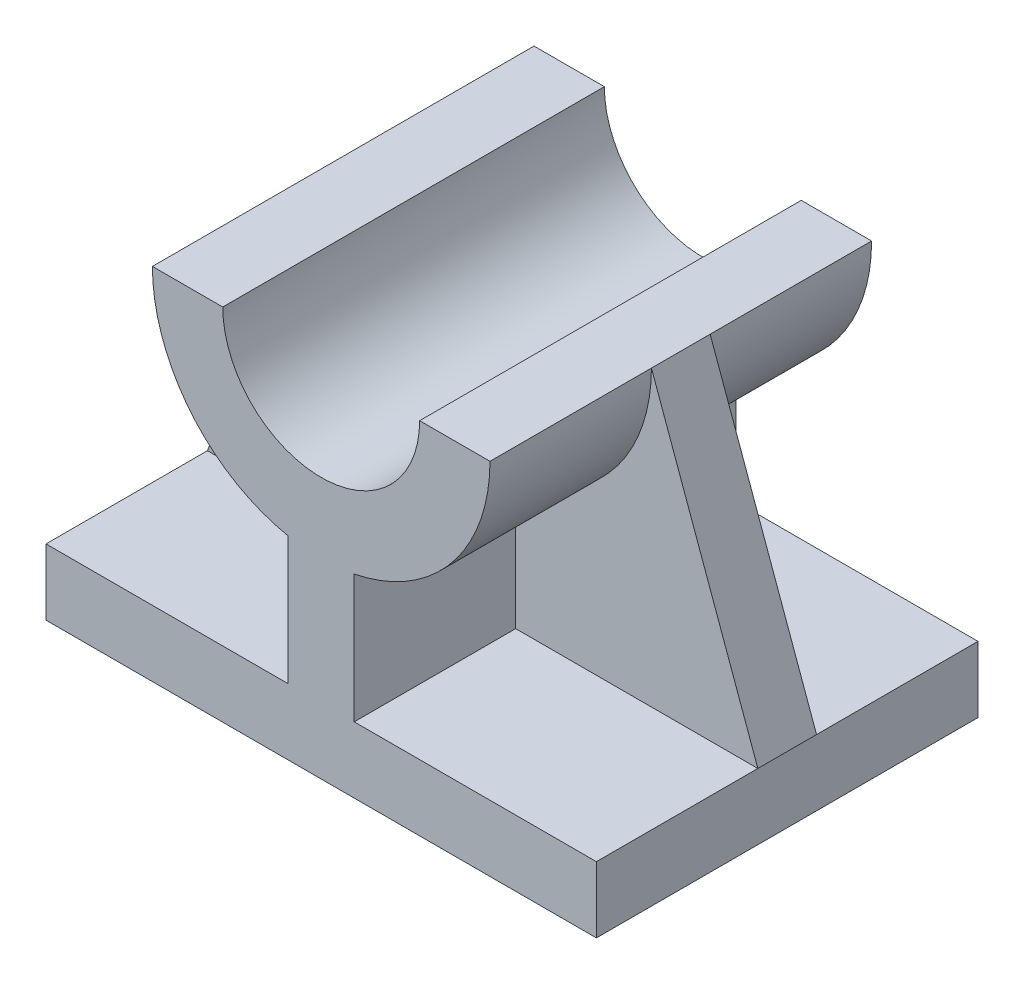
ISO-10303-21;
HEADER;
FILE_DESCRIPTION(('STEP AP214'),'2;1');
FILE_NAME('part.step','',(''),(''),'','','');
FILE_SCHEMA(('AUTOMOTIVE_DESIGN { 1 0 10303 214 1 1 1 1 }'));
ENDSEC;
DATA;
#1=APPLICATION_CONTEXT('core data for automotive mechanical design processes');
#2=APPLICATION_PROTOCOL_DEFINITION('international standard','automotive_design',2000,#1);
#3=PRODUCT_CONTEXT('',#1,'mechanical');
#4=PRODUCT('Part','Part','',(#3));
#5=PRODUCT_RELATED_PRODUCT_CATEGORY('part','',(#4));
#6=PRODUCT_DEFINITION_FORMATION('','',#4);
#7=PRODUCT_DEFINITION_CONTEXT('part definition',#1,'design');
#8=PRODUCT_DEFINITION('design','',#6,#7);
#9=PRODUCT_DEFINITION_SHAPE('','',#8);
#10=(LENGTH_UNIT() NAMED_UNIT(*) SI_UNIT(.MILLI.,.METRE.));
#11=(NAMED_UNIT(*) PLANE_ANGLE_UNIT() SI_UNIT($,.RADIAN.));
#12=(NAMED_UNIT(*) SI_UNIT($,.STERADIAN.) SOLID_ANGLE_UNIT());
#13=UNCERTAINTY_MEASURE_WITH_UNIT(LENGTH_MEASURE(1.E-05),#10,'distance_accuracy_value','');
#14=(GEOMETRIC_REPRESENTATION_CONTEXT(3) GLOBAL_UNCERTAINTY_ASSIGNED_CONTEXT((#13)) GLOBAL_UNIT_ASSIGNED_CONTEXT((#10,
#11,#12)) REPRESENTATION_CONTEXT('',''));
#15=CARTESIAN_POINT('',(0.,0.,0.));
#16=DIRECTION('',(0.,0.,1.));
#17=DIRECTION('',(1.,0.,0.));
#18=AXIS2_PLACEMENT_3D('',#15,#16,#17);
#19=CARTESIAN_POINT('',(0.,49.,26.));
#20=DIRECTION('',(0.,0.,-1.));
#21=DIRECTION('',(-1.,0.,0.));
#22=AXIS2_PLACEMENT_3D('',#19,#20,#21);
#23=CYLINDRICAL_SURFACE('',#22,23.);
#24=DIRECTION('',(0.,0.,-1.));
#25=VECTOR('',#24,1.);
#26=CARTESIAN_POINT('',(-4.5,26.4445128627201,26.));
#27=LINE('',#26,#25);
#28=CARTESIAN_POINT('',(-4.5,26.4445128627201,-4.));
#29=VERTEX_POINT('',#28);
#30=CARTESIAN_POINT('',(-4.5,26.4445128627201,-26.));
#31=VERTEX_POINT('',#30);
#32=EDGE_CURVE('E207',#29,#31,#27,.T.);
#33=ORIENTED_EDGE('',*,*,#32,.F.);
#34=CARTESIAN_POINT('',(0.,49.,-4.));
#35=DIRECTION('',(0.,0.,1.));
#36=DIRECTION('',(1.,0.,0.));
#37=AXIS2_PLACEMENT_3D('',#34,#35,#36);
#38=CIRCLE('',#37,23.);
#39=CARTESIAN_POINT('',(-23.,49.,-4.));
#40=VERTEX_POINT('',#39);
#41=EDGE_CURVE('E382',#29,#40,#38,.F.);
#42=ORIENTED_EDGE('',*,*,#41,.T.);
#43=DIRECTION('',(0.,0.,-1.));
#44=VECTOR('',#43,1.);
#45=CARTESIAN_POINT('',(-23.,49.,26.));
#46=LINE('',#45,#44);
#47=CARTESIAN_POINT('',(-23.,49.,-26.));
#48=VERTEX_POINT('',#47);
#49=EDGE_CURVE('E206',#40,#48,#46,.T.);
#50=ORIENTED_EDGE('',*,*,#49,.T.);
#51=CARTESIAN_POINT('',(0.,49.,-26.));
#52=DIRECTION('',(0.,0.,1.));
#53=DIRECTION('',(1.,0.,0.));
#54=AXIS2_PLACEMENT_3D('',#51,#52,#53);
#55=CIRCLE('',#54,23.);
#56=EDGE_CURVE('E289',#31,#48,#55,.F.);
#57=ORIENTED_EDGE('',*,*,#56,.F.);
#58=EDGE_LOOP('',(#33,#42,#50,#57));
#59=FACE_BOUND('',#58,.T.);
#60=ADVANCED_FACE('F43',(#59),#23,.T.);
#61=CARTESIAN_POINT('',(-4.5,0.,26.));
#62=DIRECTION('',(-1.,0.,0.));
#63=DIRECTION('',(0.,0.,1.));
#64=AXIS2_PLACEMENT_3D('',#61,#62,#63);
#65=PLANE('',#64);
#66=DIRECTION('',(0.,0.,-1.));
#67=VECTOR('',#66,1.);
#68=CARTESIAN_POINT('',(-4.5,9.00000000000001,26.));
#69=LINE('',#68,#67);
#70=CARTESIAN_POINT('',(-4.5,9.00000000000001,-4.));
#71=VERTEX_POINT('',#70);
#72=CARTESIAN_POINT('',(-4.5,9.00000000000001,-26.));
#73=VERTEX_POINT('',#72);
#74=EDGE_CURVE('E216',#71,#73,#69,.T.);
#75=ORIENTED_EDGE('',*,*,#74,.F.);
#76=DIRECTION('',(0.,1.,0.));
#77=VECTOR('',#76,1.);
#78=CARTESIAN_POINT('',(-4.5,0.,-4.));
#79=LINE('',#78,#77);
#80=EDGE_CURVE('E386',#71,#29,#79,.T.);
#81=ORIENTED_EDGE('',*,*,#80,.T.);
#82=ORIENTED_EDGE('',*,*,#32,.T.);
#83=DIRECTION('',(0.,1.,0.));
#84=VECTOR('',#83,1.);
#85=CARTESIAN_POINT('',(-4.5,0.,-26.));
#86=LINE('',#85,#84);
#87=EDGE_CURVE('E285',#73,#31,#86,.T.);
#88=ORIENTED_EDGE('',*,*,#87,.F.);
#89=EDGE_LOOP('',(#75,#81,#82,#88));
#90=FACE_BOUND('',#89,.T.);
#91=ADVANCED_FACE('F425',(#90),#65,.T.);
#92=CARTESIAN_POINT('',(0.,9.00000000000001,26.));
#93=DIRECTION('',(0.,-1.,0.));
#94=DIRECTION('',(1.,0.,0.));
#95=AXIS2_PLACEMENT_3D('',#92,#93,#94);
#96=PLANE('',#95);
#97=DIRECTION('',(-1.,0.,0.));
#98=VECTOR('',#97,1.);
#99=CARTESIAN_POINT('',(0.,9.00000000000001,-4.));
#100=LINE('',#99,#98);
#101=CARTESIAN_POINT('',(-37.5,9.,-3.99999999999999));
#102=VERTEX_POINT('',#101);
#103=EDGE_CURVE('E59',#71,#102,#100,.T.);
#104=ORIENTED_EDGE('',*,*,#103,.F.);
#105=ORIENTED_EDGE('',*,*,#74,.T.);
#106=DIRECTION('',(-1.,0.,0.));
#107=VECTOR('',#106,1.);
#108=CARTESIAN_POINT('',(0.,9.00000000000001,-26.));
#109=LINE('',#108,#107);
#110=CARTESIAN_POINT('',(-37.5,9.,-26.));
#111=VERTEX_POINT('',#110);
#112=EDGE_CURVE('E281',#73,#111,#109,.T.);
#113=ORIENTED_EDGE('',*,*,#112,.T.);
#114=DIRECTION('',(0.,0.,-1.));
#115=VECTOR('',#114,1.);
#116=CARTESIAN_POINT('',(-37.5,9.,26.));
#117=LINE('',#116,#115);
#118=EDGE_CURVE('E221',#102,#111,#117,.T.);
#119=ORIENTED_EDGE('',*,*,#118,.F.);
#120=EDGE_LOOP('',(#104,#105,#113,#119));
#121=FACE_BOUND('',#120,.T.);
#122=ADVANCED_FACE('F427',(#121),#96,.F.);
#123=CARTESIAN_POINT('',(0.,9.00000000000001,26.));
#124=DIRECTION('',(0.,-1.,0.));
#125=DIRECTION('',(0.,0.,-1.));
#126=AXIS2_PLACEMENT_3D('',#123,#124,#125);
#127=PLANE('',#126);
#128=DIRECTION('',(-1.,0.,0.));
#129=VECTOR('',#128,1.);
#130=CARTESIAN_POINT('',(0.,9.00000000000001,-4.));
#131=LINE('',#130,#129);
#132=CARTESIAN_POINT('',(37.5,9.00000000000001,-4.));
#133=VERTEX_POINT('',#132);
#134=CARTESIAN_POINT('',(4.5,9.00000000000001,-4.));
#135=VERTEX_POINT('',#134);
#136=EDGE_CURVE('E347',#133,#135,#131,.T.);
#137=ORIENTED_EDGE('',*,*,#136,.F.);
#138=DIRECTION('',(0.,0.,-1.));
#139=VECTOR('',#138,1.);
#140=CARTESIAN_POINT('',(37.5,9.00000000000001,26.));
#141=LINE('',#140,#139);
#142=CARTESIAN_POINT('',(37.5,9.00000000000001,-26.));
#143=VERTEX_POINT('',#142);
#144=EDGE_CURVE('E234',#133,#143,#141,.T.);
#145=ORIENTED_EDGE('',*,*,#144,.T.);
#146=DIRECTION('',(-1.,0.,0.));
#147=VECTOR('',#146,1.);
#148=CARTESIAN_POINT('',(0.,9.00000000000001,-26.));
#149=LINE('',#148,#147);
#150=CARTESIAN_POINT('',(4.5,9.00000000000001,-26.));
#151=VERTEX_POINT('',#150);
#152=EDGE_CURVE('E267',#143,#151,#149,.T.);
#153=ORIENTED_EDGE('',*,*,#152,.T.);
#154=DIRECTION('',(0.,0.,-1.));
#155=VECTOR('',#154,1.);
#156=CARTESIAN_POINT('',(4.5,9.00000000000001,26.));
#157=LINE('',#156,#155);
#158=EDGE_CURVE('E239',#135,#151,#157,.T.);
#159=ORIENTED_EDGE('',*,*,#158,.F.);
#160=EDGE_LOOP('',(#137,#145,#153,#159));
#161=FACE_BOUND('',#160,.T.);
#162=ADVANCED_FACE('F476',(#161),#127,.F.);
#163=CARTESIAN_POINT('',(4.5,0.,26.));
#164=DIRECTION('',(-1.,0.,0.));
#165=DIRECTION('',(0.,0.,1.));
#166=AXIS2_PLACEMENT_3D('',#163,#164,#165);
#167=PLANE('',#166);
#168=DIRECTION('',(0.,1.,0.));
#169=VECTOR('',#168,1.);
#170=CARTESIAN_POINT('',(4.5,0.,-4.));
#171=LINE('',#170,#169);
#172=CARTESIAN_POINT('',(4.5,26.4445128627201,-4.));
#173=VERTEX_POINT('',#172);
#174=EDGE_CURVE('E350',#135,#173,#171,.T.);
#175=ORIENTED_EDGE('',*,*,#174,.F.);
#176=ORIENTED_EDGE('',*,*,#158,.T.);
#177=DIRECTION('',(0.,1.,0.));
#178=VECTOR('',#177,1.);
#179=CARTESIAN_POINT('',(4.5,0.,-26.));
#180=LINE('',#179,#178);
#181=CARTESIAN_POINT('',(4.5,26.4445128627201,-26.));
#182=VERTEX_POINT('',#181);
#183=EDGE_CURVE('E263',#151,#182,#180,.T.);
#184=ORIENTED_EDGE('',*,*,#183,.T.);
#185=DIRECTION('',(0.,0.,-1.));
#186=VECTOR('',#185,1.);
#187=CARTESIAN_POINT('',(4.5,26.4445128627201,26.));
#188=LINE('',#187,#186);
#189=EDGE_CURVE('E244',#173,#182,#188,.T.);
#190=ORIENTED_EDGE('',*,*,#189,.F.);
#191=EDGE_LOOP('',(#175,#176,#184,#190));
#192=FACE_BOUND('',#191,.T.);
#193=ADVANCED_FACE('F482',(#192),#167,.F.);
#194=CARTESIAN_POINT('',(0.,49.,26.));
#195=DIRECTION('',(0.,0.,-1.));
#196=DIRECTION('',(-1.,0.,0.));
#197=AXIS2_PLACEMENT_3D('',#194,#195,#196);
#198=CYLINDRICAL_SURFACE('',#197,23.);
#199=CARTESIAN_POINT('',(0.,49.,-4.));
#200=DIRECTION('',(0.,0.,1.));
#201=DIRECTION('',(1.,0.,0.));
#202=AXIS2_PLACEMENT_3D('',#199,#200,#201);
#203=CIRCLE('',#202,23.);
#204=CARTESIAN_POINT('',(23.,49.,-3.99999999999999));
#205=VERTEX_POINT('',#204);
#206=EDGE_CURVE('E353',#173,#205,#203,.T.);
#207=ORIENTED_EDGE('',*,*,#206,.F.);
#208=ORIENTED_EDGE('',*,*,#189,.T.);
#209=CARTESIAN_POINT('',(0.,49.,-26.));
#210=DIRECTION('',(0.,0.,1.));
#211=DIRECTION('',(1.,0.,0.));
#212=AXIS2_PLACEMENT_3D('',#209,#210,#211);
#213=CIRCLE('',#212,23.);
#214=CARTESIAN_POINT('',(23.,49.,-26.));
#215=VERTEX_POINT('',#214);
#216=EDGE_CURVE('E259',#182,#215,#213,.T.);
#217=ORIENTED_EDGE('',*,*,#216,.T.);
#218=DIRECTION('',(0.,0.,-1.));
#219=VECTOR('',#218,1.);
#220=CARTESIAN_POINT('',(23.,49.,26.));
#221=LINE('',#220,#219);
#222=EDGE_CURVE('E249',#205,#215,#221,.T.);
#223=ORIENTED_EDGE('',*,*,#222,.F.);
#224=EDGE_LOOP('',(#207,#208,#217,#223));
#225=FACE_BOUND('',#224,.T.);
#226=ADVANCED_FACE('F443',(#225),#198,.T.);
#227=CARTESIAN_POINT('',(0.,49.,26.));
#228=DIRECTION('',(0.,0.,-1.));
#229=DIRECTION('',(-1.,0.,0.));
#230=AXIS2_PLACEMENT_3D('',#227,#228,#229);
#231=CYLINDRICAL_SURFACE('',#230,13.4155127494681);
#232=CARTESIAN_POINT('',(0.,49.,-26.));
#233=DIRECTION('',(0.,0.,1.));
#234=DIRECTION('',(1.,0.,0.));
#235=AXIS2_PLACEMENT_3D('',#232,#233,#234);
#236=CIRCLE('',#235,13.4155127494681);
#237=CARTESIAN_POINT('',(13.4155127494681,49.,-26.));
#238=VERTEX_POINT('',#237);
#239=CARTESIAN_POINT('',(-13.4155127494681,49.,-26.));
#240=VERTEX_POINT('',#239);
#241=EDGE_CURVE('E297',#238,#240,#236,.F.);
#242=ORIENTED_EDGE('',*,*,#241,.T.);
#243=DIRECTION('',(0.,0.,-1.));
#244=VECTOR('',#243,1.);
#245=CARTESIAN_POINT('',(-13.4155127494681,49.,26.));
#246=LINE('',#245,#244);
#247=CARTESIAN_POINT('',(-13.4155127494681,49.,26.));
#248=VERTEX_POINT('',#247);
#249=EDGE_CURVE('E11',#248,#240,#246,.T.);
#250=ORIENTED_EDGE('',*,*,#249,.F.);
#251=CARTESIAN_POINT('',(0.,49.,26.));
#252=DIRECTION('',(0.,0.,1.));
#253=DIRECTION('',(1.,0.,0.));
#254=AXIS2_PLACEMENT_3D('',#251,#252,#253);
#255=CIRCLE('',#254,13.4155127494681);
#256=CARTESIAN_POINT('',(13.4155127494681,49.,26.));
#257=VERTEX_POINT('',#256);
#258=EDGE_CURVE('E258',#257,#248,#255,.F.);
#259=ORIENTED_EDGE('',*,*,#258,.F.);
#260=DIRECTION('',(0.,0.,-1.));
#261=VECTOR('',#260,1.);
#262=CARTESIAN_POINT('',(13.4155127494681,49.,26.));
#263=LINE('',#262,#261);
#264=EDGE_CURVE('E250',#257,#238,#263,.T.);
#265=ORIENTED_EDGE('',*,*,#264,.T.);
#266=EDGE_LOOP('',(#242,#250,#259,#265));
#267=FACE_BOUND('',#266,.T.);
#268=ADVANCED_FACE('F45',(#267),#231,.F.);
#269=CARTESIAN_POINT('',(0.,49.,26.));
#270=DIRECTION('',(0.,1.,0.));
#271=DIRECTION('',(0.,0.,1.));
#272=AXIS2_PLACEMENT_3D('',#269,#270,#271);
#273=PLANE('',#272);
#274=DIRECTION('',(1.,0.,0.));
#275=VECTOR('',#274,1.);
#276=CARTESIAN_POINT('',(0.,49.,-26.));
#277=LINE('',#276,#275);
#278=EDGE_CURVE('E293',#48,#240,#277,.T.);
#279=ORIENTED_EDGE('',*,*,#278,.F.);
#280=ORIENTED_EDGE('',*,*,#49,.F.);
#281=DIRECTION('',(0.,0.,-1.));
#282=VECTOR('',#281,1.);
#283=CARTESIAN_POINT('',(-23.,49.,4.));
#284=LINE('',#283,#282);
#285=CARTESIAN_POINT('',(-23.,49.,4.));
#286=VERTEX_POINT('',#285);
#287=EDGE_CURVE('E356',#286,#40,#284,.T.);
#288=ORIENTED_EDGE('',*,*,#287,.F.);
#289=CARTESIAN_POINT('',(-23.,49.,26.));
#290=VERTEX_POINT('',#289);
#291=EDGE_CURVE('E52',#290,#286,#46,.T.);
#292=ORIENTED_EDGE('',*,*,#291,.F.);
#293=DIRECTION('',(1.,0.,0.));
#294=VECTOR('',#293,1.);
#295=CARTESIAN_POINT('',(0.,49.,26.));
#296=LINE('',#295,#294);
#297=EDGE_CURVE('E331',#290,#248,#296,.T.);
#298=ORIENTED_EDGE('',*,*,#297,.T.);
#299=ORIENTED_EDGE('',*,*,#249,.T.);
#300=EDGE_LOOP('',(#279,#280,#288,#292,#298,#299));
#301=FACE_BOUND('',#300,.T.);
#302=ADVANCED_FACE('F416',(#301),#273,.T.);
#303=CARTESIAN_POINT('',(0.,49.,4.));
#304=DIRECTION('',(0.,0.,1.));
#305=DIRECTION('',(1.,0.,0.));
#306=AXIS2_PLACEMENT_3D('',#303,#304,#305);
#307=CIRCLE('',#306,23.);
#308=CARTESIAN_POINT('',(-4.5,26.4445128627201,4.));
#309=VERTEX_POINT('',#308);
#310=EDGE_CURVE('E183',#309,#286,#307,.F.);
#311=ORIENTED_EDGE('',*,*,#310,.F.);
#312=CARTESIAN_POINT('',(-4.5,26.4445128627201,26.));
#313=VERTEX_POINT('',#312);
#314=EDGE_CURVE('E196',#313,#309,#27,.T.);
#315=ORIENTED_EDGE('',*,*,#314,.F.);
#316=CARTESIAN_POINT('',(0.,49.,26.));
#317=DIRECTION('',(0.,0.,1.));
#318=DIRECTION('',(1.,0.,0.));
#319=AXIS2_PLACEMENT_3D('',#316,#317,#318);
#320=CIRCLE('',#319,23.);
#321=EDGE_CURVE('E328',#313,#290,#320,.F.);
#322=ORIENTED_EDGE('',*,*,#321,.T.);
#323=ORIENTED_EDGE('',*,*,#291,.T.);
#324=EDGE_LOOP('',(#311,#315,#322,#323));
#325=FACE_BOUND('',#324,.T.);
#326=ADVANCED_FACE('F194',(#325),#23,.T.);
#327=DIRECTION('',(0.,1.,0.));
#328=VECTOR('',#327,1.);
#329=CARTESIAN_POINT('',(-4.5,0.,4.));
#330=LINE('',#329,#328);
#331=CARTESIAN_POINT('',(-4.5,9.00000000000001,4.));
#332=VERTEX_POINT('',#331);
#333=EDGE_CURVE('E180',#332,#309,#330,.T.);
#334=ORIENTED_EDGE('',*,*,#333,.F.);
#335=CARTESIAN_POINT('',(-4.5,9.00000000000001,26.));
#336=VERTEX_POINT('',#335);
#337=EDGE_CURVE('E211',#336,#332,#69,.T.);
#338=ORIENTED_EDGE('',*,*,#337,.F.);
#339=DIRECTION('',(0.,1.,0.));
#340=VECTOR('',#339,1.);
#341=CARTESIAN_POINT('',(-4.5,0.,26.));
#342=LINE('',#341,#340);
#343=EDGE_CURVE('E204',#336,#313,#342,.T.);
#344=ORIENTED_EDGE('',*,*,#343,.T.);
#345=ORIENTED_EDGE('',*,*,#314,.T.);
#346=EDGE_LOOP('',(#334,#338,#344,#345));
#347=FACE_BOUND('',#346,.T.);
#348=ADVANCED_FACE('F202',(#347),#65,.T.);
#349=ORIENTED_EDGE('',*,*,#337,.T.);
#350=DIRECTION('',(-1.,0.,0.));
#351=VECTOR('',#350,1.);
#352=CARTESIAN_POINT('',(0.,9.00000000000001,4.));
#353=LINE('',#352,#351);
#354=CARTESIAN_POINT('',(-37.5,9.,4.));
#355=VERTEX_POINT('',#354);
#356=EDGE_CURVE('E186',#332,#355,#353,.T.);
#357=ORIENTED_EDGE('',*,*,#356,.T.);
#358=CARTESIAN_POINT('',(-37.5,9.,26.));
#359=VERTEX_POINT('',#358);
#360=EDGE_CURVE('E217',#359,#355,#117,.T.);
#361=ORIENTED_EDGE('',*,*,#360,.F.);
#362=DIRECTION('',(-1.,0.,0.));
#363=VECTOR('',#362,1.);
#364=CARTESIAN_POINT('',(0.,9.00000000000001,26.));
#365=LINE('',#364,#363);
#366=EDGE_CURVE('E323',#336,#359,#365,.T.);
#367=ORIENTED_EDGE('',*,*,#366,.F.);
#368=EDGE_LOOP('',(#349,#357,#361,#367));
#369=FACE_BOUND('',#368,.T.);
#370=ADVANCED_FACE('F401',(#369),#96,.F.);
#371=CARTESIAN_POINT('',(-37.5,0.,26.));
#372=DIRECTION('',(1.,0.,0.));
#373=DIRECTION('',(0.,0.,-1.));
#374=AXIS2_PLACEMENT_3D('',#371,#372,#373);
#375=PLANE('',#374);
#376=DIRECTION('',(0.,-1.,0.));
#377=VECTOR('',#376,1.);
#378=CARTESIAN_POINT('',(-37.5,0.,-26.));
#379=LINE('',#378,#377);
#380=CARTESIAN_POINT('',(-37.5,0.,-26.));
#381=VERTEX_POINT('',#380);
#382=EDGE_CURVE('E278',#111,#381,#379,.T.);
#383=ORIENTED_EDGE('',*,*,#382,.T.);
#384=DIRECTION('',(0.,0.,-1.));
#385=VECTOR('',#384,1.);
#386=CARTESIAN_POINT('',(-37.5,0.,26.));
#387=LINE('',#386,#385);
#388=CARTESIAN_POINT('',(-37.5,0.,26.));
#389=VERTEX_POINT('',#388);
#390=EDGE_CURVE('E222',#389,#381,#387,.T.);
#391=ORIENTED_EDGE('',*,*,#390,.F.);
#392=DIRECTION('',(0.,-1.,0.));
#393=VECTOR('',#392,1.);
#394=CARTESIAN_POINT('',(-37.5,0.,26.));
#395=LINE('',#394,#393);
#396=EDGE_CURVE('E320',#359,#389,#395,.T.);
#397=ORIENTED_EDGE('',*,*,#396,.F.);
#398=ORIENTED_EDGE('',*,*,#360,.T.);
#399=DIRECTION('',(0.,0.,-1.));
#400=VECTOR('',#399,1.);
#401=CARTESIAN_POINT('',(-37.5,9.,4.));
#402=LINE('',#401,#400);
#403=EDGE_CURVE('E373',#355,#102,#402,.T.);
#404=ORIENTED_EDGE('',*,*,#403,.T.);
#405=ORIENTED_EDGE('',*,*,#118,.T.);
#406=EDGE_LOOP('',(#383,#391,#397,#398,#404,#405));
#407=FACE_BOUND('',#406,.T.);
#408=ADVANCED_FACE('F404',(#407),#375,.F.);
#409=CARTESIAN_POINT('',(0.,0.,26.));
#410=DIRECTION('',(0.,1.,0.));
#411=DIRECTION('',(0.,0.,1.));
#412=AXIS2_PLACEMENT_3D('',#409,#410,#411);
#413=PLANE('',#412);
#414=DIRECTION('',(1.,0.,0.));
#415=VECTOR('',#414,1.);
#416=CARTESIAN_POINT('',(0.,0.,-26.));
#417=LINE('',#416,#415);
#418=CARTESIAN_POINT('',(37.5,0.,-26.));
#419=VERTEX_POINT('',#418);
#420=EDGE_CURVE('E275',#381,#419,#417,.T.);
#421=ORIENTED_EDGE('',*,*,#420,.T.);
#422=DIRECTION('',(0.,0.,-1.));
#423=VECTOR('',#422,1.);
#424=CARTESIAN_POINT('',(37.5,0.,26.));
#425=LINE('',#424,#423);
#426=CARTESIAN_POINT('',(37.5,0.,26.));
#427=VERTEX_POINT('',#426);
#428=EDGE_CURVE('E226',#427,#419,#425,.T.);
#429=ORIENTED_EDGE('',*,*,#428,.F.);
#430=DIRECTION('',(1.,0.,0.));
#431=VECTOR('',#430,1.);
#432=CARTESIAN_POINT('',(0.,0.,26.));
#433=LINE('',#432,#431);
#434=EDGE_CURVE('E317',#389,#427,#433,.T.);
#435=ORIENTED_EDGE('',*,*,#434,.F.);
#436=ORIENTED_EDGE('',*,*,#390,.T.);
#437=EDGE_LOOP('',(#421,#429,#435,#436));
#438=FACE_BOUND('',#437,.T.);
#439=ADVANCED_FACE('F485',(#438),#413,.F.);
#440=CARTESIAN_POINT('',(37.5,0.,26.));
#441=DIRECTION('',(-1.,0.,0.));
#442=DIRECTION('',(0.,0.,1.));
#443=AXIS2_PLACEMENT_3D('',#440,#441,#442);
#444=PLANE('',#443);
#445=DIRECTION('',(0.,1.,0.));
#446=VECTOR('',#445,1.);
#447=CARTESIAN_POINT('',(37.5,0.,-26.));
#448=LINE('',#447,#446);
#449=EDGE_CURVE('E271',#419,#143,#448,.T.);
#450=ORIENTED_EDGE('',*,*,#449,.T.);
#451=ORIENTED_EDGE('',*,*,#144,.F.);
#452=DIRECTION('',(0.,0.,-1.));
#453=VECTOR('',#452,1.);
#454=CARTESIAN_POINT('',(37.5,9.00000000000001,4.));
#455=LINE('',#454,#453);
#456=CARTESIAN_POINT('',(37.5,9.00000000000001,4.));
#457=VERTEX_POINT('',#456);
#458=EDGE_CURVE('E301',#457,#133,#455,.T.);
#459=ORIENTED_EDGE('',*,*,#458,.F.);
#460=CARTESIAN_POINT('',(37.5,9.00000000000001,26.));
#461=VERTEX_POINT('',#460);
#462=EDGE_CURVE('E230',#461,#457,#141,.T.);
#463=ORIENTED_EDGE('',*,*,#462,.F.);
#464=DIRECTION('',(0.,1.,0.));
#465=VECTOR('',#464,1.);
#466=CARTESIAN_POINT('',(37.5,0.,26.));
#467=LINE('',#466,#465);
#468=EDGE_CURVE('E314',#427,#461,#467,.T.);
#469=ORIENTED_EDGE('',*,*,#468,.F.);
#470=ORIENTED_EDGE('',*,*,#428,.T.);
#471=EDGE_LOOP('',(#450,#451,#459,#463,#469,#470));
#472=FACE_BOUND('',#471,.T.);
#473=ADVANCED_FACE('F470',(#472),#444,.F.);
#474=ORIENTED_EDGE('',*,*,#462,.T.);
#475=DIRECTION('',(-1.,0.,0.));
#476=VECTOR('',#475,1.);
#477=CARTESIAN_POINT('',(0.,9.00000000000001,4.));
#478=LINE('',#477,#476);
#479=CARTESIAN_POINT('',(4.5,9.00000000000001,4.));
#480=VERTEX_POINT('',#479);
#481=EDGE_CURVE('E360',#457,#480,#478,.T.);
#482=ORIENTED_EDGE('',*,*,#481,.T.);
#483=CARTESIAN_POINT('',(4.5,9.00000000000001,26.));
#484=VERTEX_POINT('',#483);
#485=EDGE_CURVE('E235',#484,#480,#157,.T.);
#486=ORIENTED_EDGE('',*,*,#485,.F.);
#487=DIRECTION('',(-1.,0.,0.));
#488=VECTOR('',#487,1.);
#489=CARTESIAN_POINT('',(0.,9.00000000000001,26.));
#490=LINE('',#489,#488);
#491=EDGE_CURVE('E311',#461,#484,#490,.T.);
#492=ORIENTED_EDGE('',*,*,#491,.F.);
#493=EDGE_LOOP('',(#474,#482,#486,#492));
#494=FACE_BOUND('',#493,.T.);
#495=ADVANCED_FACE('F464',(#494),#127,.F.);
#496=ORIENTED_EDGE('',*,*,#485,.T.);
#497=DIRECTION('',(0.,1.,0.));
#498=VECTOR('',#497,1.);
#499=CARTESIAN_POINT('',(4.5,0.,4.));
#500=LINE('',#499,#498);
#501=CARTESIAN_POINT('',(4.5,26.4445128627201,4.));
#502=VERTEX_POINT('',#501);
#503=EDGE_CURVE('E364',#480,#502,#500,.T.);
#504=ORIENTED_EDGE('',*,*,#503,.T.);
#505=CARTESIAN_POINT('',(4.5,26.4445128627201,26.));
#506=VERTEX_POINT('',#505);
#507=EDGE_CURVE('E240',#506,#502,#188,.T.);
#508=ORIENTED_EDGE('',*,*,#507,.F.);
#509=DIRECTION('',(0.,1.,0.));
#510=VECTOR('',#509,1.);
#511=CARTESIAN_POINT('',(4.5,0.,26.));
#512=LINE('',#511,#510);
#513=EDGE_CURVE('E308',#484,#506,#512,.T.);
#514=ORIENTED_EDGE('',*,*,#513,.F.);
#515=EDGE_LOOP('',(#496,#504,#508,#514));
#516=FACE_BOUND('',#515,.T.);
#517=ADVANCED_FACE('F460',(#516),#167,.F.);
#518=ORIENTED_EDGE('',*,*,#507,.T.);
#519=CARTESIAN_POINT('',(0.,49.,4.));
#520=DIRECTION('',(0.,0.,1.));
#521=DIRECTION('',(1.,0.,0.));
#522=AXIS2_PLACEMENT_3D('',#519,#520,#521);
#523=CIRCLE('',#522,23.);
#524=CARTESIAN_POINT('',(23.,49.,4.));
#525=VERTEX_POINT('',#524);
#526=EDGE_CURVE('E346',#502,#525,#523,.T.);
#527=ORIENTED_EDGE('',*,*,#526,.T.);
#528=CARTESIAN_POINT('',(23.,49.,26.));
#529=VERTEX_POINT('',#528);
#530=EDGE_CURVE('E245',#529,#525,#221,.T.);
#531=ORIENTED_EDGE('',*,*,#530,.F.);
#532=CARTESIAN_POINT('',(0.,49.,26.));
#533=DIRECTION('',(0.,0.,1.));
#534=DIRECTION('',(1.,0.,0.));
#535=AXIS2_PLACEMENT_3D('',#532,#533,#534);
#536=CIRCLE('',#535,23.);
#537=EDGE_CURVE('E305',#506,#529,#536,.T.);
#538=ORIENTED_EDGE('',*,*,#537,.F.);
#539=EDGE_LOOP('',(#518,#527,#531,#538));
#540=FACE_BOUND('',#539,.T.);
#541=ADVANCED_FACE('F455',(#540),#198,.T.);
#542=CARTESIAN_POINT('',(0.,49.,26.));
#543=DIRECTION('',(0.,1.,0.));
#544=DIRECTION('',(0.,0.,1.));
#545=AXIS2_PLACEMENT_3D('',#542,#543,#544);
#546=PLANE('',#545);
#547=DIRECTION('',(1.,0.,0.));
#548=VECTOR('',#547,1.);
#549=CARTESIAN_POINT('',(0.,49.,-26.));
#550=LINE('',#549,#548);
#551=EDGE_CURVE('E254',#238,#215,#550,.T.);
#552=ORIENTED_EDGE('',*,*,#551,.F.);
#553=ORIENTED_EDGE('',*,*,#264,.F.);
#554=DIRECTION('',(1.,0.,0.));
#555=VECTOR('',#554,1.);
#556=CARTESIAN_POINT('',(0.,49.,26.));
#557=LINE('',#556,#555);
#558=EDGE_CURVE('E253',#257,#529,#557,.T.);
#559=ORIENTED_EDGE('',*,*,#558,.T.);
#560=ORIENTED_EDGE('',*,*,#530,.T.);
#561=DIRECTION('',(0.,0.,-1.));
#562=VECTOR('',#561,1.);
#563=CARTESIAN_POINT('',(23.,49.,4.));
#564=LINE('',#563,#562);
#565=EDGE_CURVE('E339',#525,#205,#564,.T.);
#566=ORIENTED_EDGE('',*,*,#565,.T.);
#567=ORIENTED_EDGE('',*,*,#222,.T.);
#568=EDGE_LOOP('',(#552,#553,#559,#560,#566,#567));
#569=FACE_BOUND('',#568,.T.);
#570=ADVANCED_FACE('F439',(#569),#546,.T.);
#571=CARTESIAN_POINT('',(0.,0.,26.));
#572=DIRECTION('',(0.,0.,1.));
#573=DIRECTION('',(1.,0.,0.));
#574=AXIS2_PLACEMENT_3D('',#571,#572,#573);
#575=PLANE('',#574);
#576=ORIENTED_EDGE('',*,*,#258,.T.);
#577=ORIENTED_EDGE('',*,*,#297,.F.);
#578=ORIENTED_EDGE('',*,*,#321,.F.);
#579=ORIENTED_EDGE('',*,*,#343,.F.);
#580=ORIENTED_EDGE('',*,*,#366,.T.);
#581=ORIENTED_EDGE('',*,*,#396,.T.);
#582=ORIENTED_EDGE('',*,*,#434,.T.);
#583=ORIENTED_EDGE('',*,*,#468,.T.);
#584=ORIENTED_EDGE('',*,*,#491,.T.);
#585=ORIENTED_EDGE('',*,*,#513,.T.);
#586=ORIENTED_EDGE('',*,*,#537,.T.);
#587=ORIENTED_EDGE('',*,*,#558,.F.);
#588=EDGE_LOOP('',(#576,#577,#578,#579,#580,#581,#582,#583,#584,#585,#586,#587));
#589=FACE_BOUND('',#588,.T.);
#590=ADVANCED_FACE('F408',(#589),#575,.T.);
#591=CARTESIAN_POINT('',(0.,0.,-26.));
#592=DIRECTION('',(0.,0.,1.));
#593=DIRECTION('',(1.,0.,0.));
#594=AXIS2_PLACEMENT_3D('',#591,#592,#593);
#595=PLANE('',#594);
#596=ORIENTED_EDGE('',*,*,#241,.F.);
#597=ORIENTED_EDGE('',*,*,#551,.T.);
#598=ORIENTED_EDGE('',*,*,#216,.F.);
#599=ORIENTED_EDGE('',*,*,#183,.F.);
#600=ORIENTED_EDGE('',*,*,#152,.F.);
#601=ORIENTED_EDGE('',*,*,#449,.F.);
#602=ORIENTED_EDGE('',*,*,#420,.F.);
#603=ORIENTED_EDGE('',*,*,#382,.F.);
#604=ORIENTED_EDGE('',*,*,#112,.F.);
#605=ORIENTED_EDGE('',*,*,#87,.T.);
#606=ORIENTED_EDGE('',*,*,#56,.T.);
#607=ORIENTED_EDGE('',*,*,#278,.T.);
#608=EDGE_LOOP('',(#596,#597,#598,#599,#600,#601,#602,#603,#604,#605,#606,#607));
#609=FACE_BOUND('',#608,.T.);
#610=ADVANCED_FACE('F448',(#609),#595,.F.);
#611=CARTESIAN_POINT('',(36.028172904295,13.0602126778069,4.));
#612=DIRECTION('',(0.940136065162483,0.3407993236214,0.));
#613=DIRECTION('',(-0.3407993236214,0.940136065162483,0.));
#614=AXIS2_PLACEMENT_3D('',#611,#612,#613);
#615=PLANE('',#614);
#616=DIRECTION('',(0.3407993236214,-0.940136065162483,0.));
#617=VECTOR('',#616,1.);
#618=CARTESIAN_POINT('',(36.028172904295,13.0602126778069,-4.));
#619=LINE('',#618,#617);
#620=EDGE_CURVE('E67',#205,#133,#619,.T.);
#621=ORIENTED_EDGE('',*,*,#620,.F.);
#622=ORIENTED_EDGE('',*,*,#565,.F.);
#623=DIRECTION('',(0.3407993236214,-0.940136065162483,0.));
#624=VECTOR('',#623,1.);
#625=CARTESIAN_POINT('',(36.028172904295,13.0602126778069,4.));
#626=LINE('',#625,#624);
#627=EDGE_CURVE('E343',#525,#457,#626,.T.);
#628=ORIENTED_EDGE('',*,*,#627,.T.);
#629=ORIENTED_EDGE('',*,*,#458,.T.);
#630=EDGE_LOOP('',(#621,#622,#628,#629));
#631=FACE_BOUND('',#630,.T.);
#632=ADVANCED_FACE('F467',(#631),#615,.T.);
#633=CARTESIAN_POINT('',(0.,0.,4.));
#634=DIRECTION('',(0.,0.,1.));
#635=DIRECTION('',(1.,0.,0.));
#636=AXIS2_PLACEMENT_3D('',#633,#634,#635);
#637=PLANE('',#636);
#638=ORIENTED_EDGE('',*,*,#526,.F.);
#639=ORIENTED_EDGE('',*,*,#503,.F.);
#640=ORIENTED_EDGE('',*,*,#481,.F.);
#641=ORIENTED_EDGE('',*,*,#627,.F.);
#642=EDGE_LOOP('',(#638,#639,#640,#641));
#643=FACE_BOUND('',#642,.T.);
#644=ADVANCED_FACE('F458',(#643),#637,.T.);
#645=CARTESIAN_POINT('',(0.,0.,-4.));
#646=DIRECTION('',(0.,0.,1.));
#647=DIRECTION('',(1.,0.,0.));
#648=AXIS2_PLACEMENT_3D('',#645,#646,#647);
#649=PLANE('',#648);
#650=ORIENTED_EDGE('',*,*,#206,.T.);
#651=ORIENTED_EDGE('',*,*,#620,.T.);
#652=ORIENTED_EDGE('',*,*,#136,.T.);
#653=ORIENTED_EDGE('',*,*,#174,.T.);
#654=EDGE_LOOP('',(#650,#651,#652,#653));
#655=FACE_BOUND('',#654,.T.);
#656=ADVANCED_FACE('F480',(#655),#649,.F.);
#657=CARTESIAN_POINT('',(-36.028172904295,13.0602126778069,4.));
#658=DIRECTION('',(0.940136065162483,-0.3407993236214,0.));
#659=DIRECTION('',(0.3407993236214,0.940136065162483,0.));
#660=AXIS2_PLACEMENT_3D('',#657,#658,#659);
#661=PLANE('',#660);
#662=DIRECTION('',(-0.3407993236214,-0.940136065162483,0.));
#663=VECTOR('',#662,1.);
#664=CARTESIAN_POINT('',(-36.028172904295,13.0602126778069,-4.));
#665=LINE('',#664,#663);
#666=EDGE_CURVE('E379',#40,#102,#665,.T.);
#667=ORIENTED_EDGE('',*,*,#666,.T.);
#668=ORIENTED_EDGE('',*,*,#403,.F.);
#669=DIRECTION('',(-0.3407993236214,-0.940136065162483,0.));
#670=VECTOR('',#669,1.);
#671=CARTESIAN_POINT('',(-36.028172904295,13.0602126778069,4.));
#672=LINE('',#671,#670);
#673=EDGE_CURVE('E199',#286,#355,#672,.T.);
#674=ORIENTED_EDGE('',*,*,#673,.F.);
#675=ORIENTED_EDGE('',*,*,#287,.T.);
#676=EDGE_LOOP('',(#667,#668,#674,#675));
#677=FACE_BOUND('',#676,.T.);
#678=ADVANCED_FACE('F396',(#677),#661,.F.);
#679=CARTESIAN_POINT('',(0.,0.,4.));
#680=DIRECTION('',(0.,0.,1.));
#681=DIRECTION('',(1.,0.,0.));
#682=AXIS2_PLACEMENT_3D('',#679,#680,#681);
#683=PLANE('',#682);
#684=ORIENTED_EDGE('',*,*,#333,.T.);
#685=ORIENTED_EDGE('',*,*,#310,.T.);
#686=ORIENTED_EDGE('',*,*,#673,.T.);
#687=ORIENTED_EDGE('',*,*,#356,.F.);
#688=EDGE_LOOP('',(#684,#685,#686,#687));
#689=FACE_BOUND('',#688,.T.);
#690=ADVANCED_FACE('F182',(#689),#683,.T.);
#691=CARTESIAN_POINT('',(0.,0.,-4.));
#692=DIRECTION('',(0.,0.,1.));
#693=DIRECTION('',(1.,0.,0.));
#694=AXIS2_PLACEMENT_3D('',#691,#692,#693);
#695=PLANE('',#694);
#696=ORIENTED_EDGE('',*,*,#80,.F.);
#697=ORIENTED_EDGE('',*,*,#103,.T.);
#698=ORIENTED_EDGE('',*,*,#666,.F.);
#699=ORIENTED_EDGE('',*,*,#41,.F.);
#700=EDGE_LOOP('',(#696,#697,#698,#699));
#701=FACE_BOUND('',#700,.T.);
#702=ADVANCED_FACE('F418',(#701),#695,.F.);
#703=CLOSED_SHELL('',(#60,#91,#122,#162,#193,#226,#268,#302,#326,#348,#370,#408,#439,#473,#495,
#517,#541,#570,#590,#610,#632,#644,#656,#678,#690,#702));
#704=MANIFOLD_SOLID_BREP('B2',#703);
#705=ADVANCED_BREP_SHAPE_REPRESENTATION('',(#18,#704),#14);
#706=SHAPE_DEFINITION_REPRESENTATION(#9,#705);
ENDSEC;
END-ISO-10303-21;
